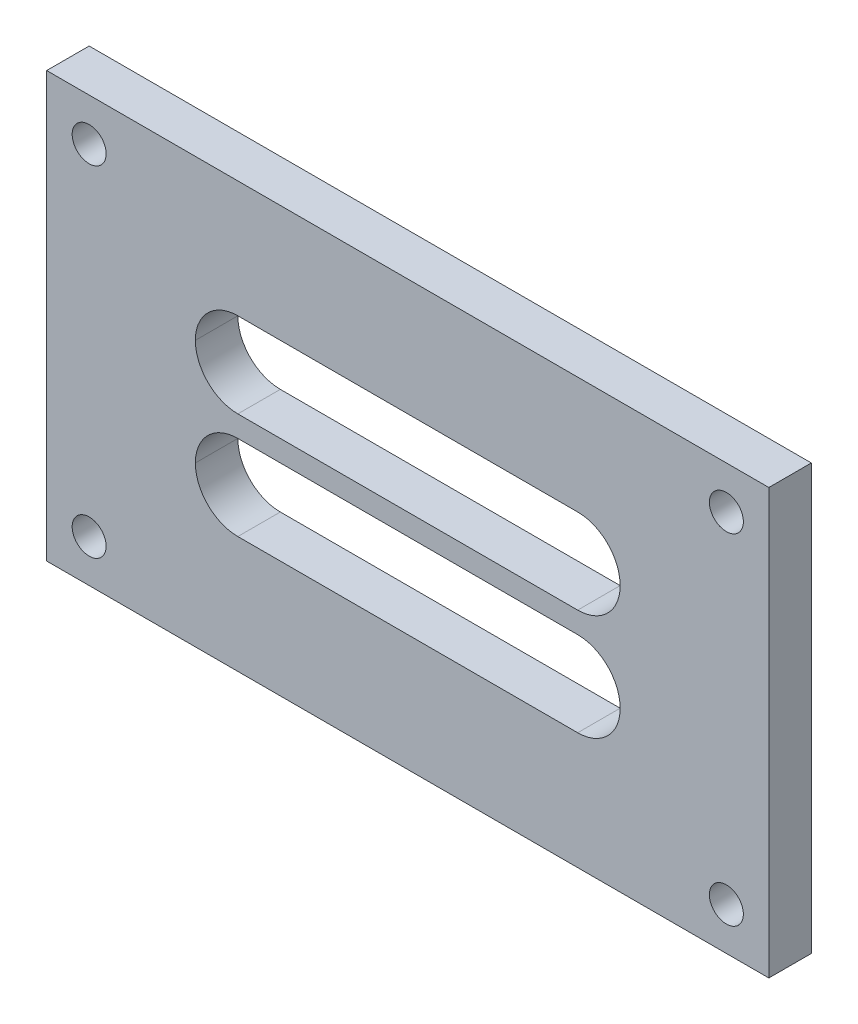
ISO-10303-21;
HEADER;
FILE_DESCRIPTION(('STEP AP214'),'2;1');
FILE_NAME('part.step','',(''),(''),'','','');
FILE_SCHEMA(('AUTOMOTIVE_DESIGN { 1 0 10303 214 1 1 1 1 }'));
ENDSEC;
DATA;
#1=APPLICATION_CONTEXT('core data for automotive mechanical design processes');
#2=APPLICATION_PROTOCOL_DEFINITION('international standard','automotive_design',2000,#1);
#3=PRODUCT_CONTEXT('',#1,'mechanical');
#4=PRODUCT('Part','Part','',(#3));
#5=PRODUCT_RELATED_PRODUCT_CATEGORY('part','',(#4));
#6=PRODUCT_DEFINITION_FORMATION('','',#4);
#7=PRODUCT_DEFINITION_CONTEXT('part definition',#1,'design');
#8=PRODUCT_DEFINITION('design','',#6,#7);
#9=PRODUCT_DEFINITION_SHAPE('','',#8);
#10=(LENGTH_UNIT() NAMED_UNIT(*) SI_UNIT(.MILLI.,.METRE.));
#11=(NAMED_UNIT(*) PLANE_ANGLE_UNIT() SI_UNIT($,.RADIAN.));
#12=(NAMED_UNIT(*) SI_UNIT($,.STERADIAN.) SOLID_ANGLE_UNIT());
#13=UNCERTAINTY_MEASURE_WITH_UNIT(LENGTH_MEASURE(1.E-05),#10,'distance_accuracy_value','');
#14=(GEOMETRIC_REPRESENTATION_CONTEXT(3) GLOBAL_UNCERTAINTY_ASSIGNED_CONTEXT((#13)) GLOBAL_UNIT_ASSIGNED_CONTEXT((#10,
#11,#12)) REPRESENTATION_CONTEXT('',''));
#15=CARTESIAN_POINT('',(0.,0.,0.));
#16=DIRECTION('',(0.,0.,1.));
#17=DIRECTION('',(1.,0.,0.));
#18=AXIS2_PLACEMENT_3D('',#15,#16,#17);
#19=CARTESIAN_POINT('',(0.,0.,2.));
#20=DIRECTION('',(0.,0.,1.));
#21=DIRECTION('',(1.,0.,0.));
#22=AXIS2_PLACEMENT_3D('',#19,#20,#21);
#23=PLANE('',#22);
#24=CARTESIAN_POINT('',(32.,18.,2.));
#25=DIRECTION('',(0.,0.,1.));
#26=DIRECTION('',(1.,0.,0.));
#27=AXIS2_PLACEMENT_3D('',#24,#25,#26);
#28=CIRCLE('',#27,0.800000000000003);
#29=CARTESIAN_POINT('',(32.8,18.,2.));
#30=VERTEX_POINT('',#29);
#31=EDGE_CURVE('E303',#30,#30,#28,.F.);
#32=ORIENTED_EDGE('',*,*,#31,.T.);
#33=EDGE_LOOP('',(#32));
#34=FACE_BOUND('',#33,.T.);
#35=CARTESIAN_POINT('',(1.99999999999999,2.,2.));
#36=DIRECTION('',(0.,0.,1.));
#37=DIRECTION('',(1.,0.,0.));
#38=AXIS2_PLACEMENT_3D('',#35,#36,#37);
#39=CIRCLE('',#38,0.799999999999999);
#40=CARTESIAN_POINT('',(2.79999999999999,2.,2.));
#41=VERTEX_POINT('',#40);
#42=EDGE_CURVE('E292',#41,#41,#39,.F.);
#43=ORIENTED_EDGE('',*,*,#42,.T.);
#44=EDGE_LOOP('',(#43));
#45=FACE_BOUND('',#44,.T.);
#46=DIRECTION('',(1.,0.,0.));
#47=VECTOR('',#46,1.);
#48=CARTESIAN_POINT('',(0.,5.5,2.));
#49=LINE('',#48,#47);
#50=CARTESIAN_POINT('',(9.,5.5,2.));
#51=VERTEX_POINT('',#50);
#52=CARTESIAN_POINT('',(25.,5.5,2.));
#53=VERTEX_POINT('',#52);
#54=EDGE_CURVE('E284',#51,#53,#49,.T.);
#55=ORIENTED_EDGE('',*,*,#54,.F.);
#56=CARTESIAN_POINT('',(9.,7.5,2.));
#57=DIRECTION('',(0.,0.,1.));
#58=DIRECTION('',(1.,0.,0.));
#59=AXIS2_PLACEMENT_3D('',#56,#57,#58);
#60=CIRCLE('',#59,2.);
#61=CARTESIAN_POINT('',(7.,7.5,2.));
#62=VERTEX_POINT('',#61);
#63=EDGE_CURVE('E237',#51,#62,#60,.F.);
#64=ORIENTED_EDGE('',*,*,#63,.T.);
#65=CARTESIAN_POINT('',(9.,7.5,2.));
#66=DIRECTION('',(0.,0.,1.));
#67=DIRECTION('',(1.,0.,0.));
#68=AXIS2_PLACEMENT_3D('',#65,#66,#67);
#69=CIRCLE('',#68,2.);
#70=CARTESIAN_POINT('',(9.,9.5,2.));
#71=VERTEX_POINT('',#70);
#72=EDGE_CURVE('E233',#62,#71,#69,.F.);
#73=ORIENTED_EDGE('',*,*,#72,.T.);
#74=DIRECTION('',(1.,0.,0.));
#75=VECTOR('',#74,1.);
#76=CARTESIAN_POINT('',(0.,9.5,2.));
#77=LINE('',#76,#75);
#78=CARTESIAN_POINT('',(25.,9.5,2.));
#79=VERTEX_POINT('',#78);
#80=EDGE_CURVE('E206',#71,#79,#77,.T.);
#81=ORIENTED_EDGE('',*,*,#80,.T.);
#82=CARTESIAN_POINT('',(25.,7.5,2.));
#83=DIRECTION('',(0.,0.,1.));
#84=DIRECTION('',(1.,0.,0.));
#85=AXIS2_PLACEMENT_3D('',#82,#83,#84);
#86=CIRCLE('',#85,2.);
#87=CARTESIAN_POINT('',(27.,7.50000000000001,2.));
#88=VERTEX_POINT('',#87);
#89=EDGE_CURVE('E241',#79,#88,#86,.F.);
#90=ORIENTED_EDGE('',*,*,#89,.T.);
#91=CARTESIAN_POINT('',(25.,7.5,2.));
#92=DIRECTION('',(0.,0.,1.));
#93=DIRECTION('',(1.,0.,0.));
#94=AXIS2_PLACEMENT_3D('',#91,#92,#93);
#95=CIRCLE('',#94,2.);
#96=EDGE_CURVE('E245',#88,#53,#95,.F.);
#97=ORIENTED_EDGE('',*,*,#96,.T.);
#98=EDGE_LOOP('',(#55,#64,#73,#81,#90,#97));
#99=FACE_BOUND('',#98,.T.);
#100=CARTESIAN_POINT('',(9.,12.5,2.));
#101=DIRECTION('',(0.,0.,1.));
#102=DIRECTION('',(1.,0.,0.));
#103=AXIS2_PLACEMENT_3D('',#100,#101,#102);
#104=CIRCLE('',#103,2.);
#105=CARTESIAN_POINT('',(9.,10.5,2.));
#106=VERTEX_POINT('',#105);
#107=CARTESIAN_POINT('',(7.,12.5,2.));
#108=VERTEX_POINT('',#107);
#109=EDGE_CURVE('E55',#106,#108,#104,.F.);
#110=ORIENTED_EDGE('',*,*,#109,.T.);
#111=CARTESIAN_POINT('',(9.,12.5,2.));
#112=DIRECTION('',(0.,0.,1.));
#113=DIRECTION('',(1.,0.,0.));
#114=AXIS2_PLACEMENT_3D('',#111,#112,#113);
#115=CIRCLE('',#114,2.);
#116=CARTESIAN_POINT('',(9.,14.5,2.));
#117=VERTEX_POINT('',#116);
#118=EDGE_CURVE('E11',#108,#117,#115,.F.);
#119=ORIENTED_EDGE('',*,*,#118,.T.);
#120=DIRECTION('',(1.,0.,0.));
#121=VECTOR('',#120,1.);
#122=CARTESIAN_POINT('',(0.,14.5,2.));
#123=LINE('',#122,#121);
#124=CARTESIAN_POINT('',(25.,14.5,2.));
#125=VERTEX_POINT('',#124);
#126=EDGE_CURVE('E279',#117,#125,#123,.T.);
#127=ORIENTED_EDGE('',*,*,#126,.T.);
#128=CARTESIAN_POINT('',(25.,12.5,2.));
#129=DIRECTION('',(0.,0.,1.));
#130=DIRECTION('',(1.,0.,0.));
#131=AXIS2_PLACEMENT_3D('',#128,#129,#130);
#132=CIRCLE('',#131,2.);
#133=CARTESIAN_POINT('',(27.,12.5,2.));
#134=VERTEX_POINT('',#133);
#135=EDGE_CURVE('E253',#125,#134,#132,.F.);
#136=ORIENTED_EDGE('',*,*,#135,.T.);
#137=CARTESIAN_POINT('',(25.,12.5,2.));
#138=DIRECTION('',(0.,0.,1.));
#139=DIRECTION('',(1.,0.,0.));
#140=AXIS2_PLACEMENT_3D('',#137,#138,#139);
#141=CIRCLE('',#140,2.);
#142=CARTESIAN_POINT('',(25.,10.5,2.));
#143=VERTEX_POINT('',#142);
#144=EDGE_CURVE('E249',#134,#143,#141,.F.);
#145=ORIENTED_EDGE('',*,*,#144,.T.);
#146=DIRECTION('',(1.,0.,0.));
#147=VECTOR('',#146,1.);
#148=CARTESIAN_POINT('',(0.,10.5,2.));
#149=LINE('',#148,#147);
#150=EDGE_CURVE('E173',#106,#143,#149,.T.);
#151=ORIENTED_EDGE('',*,*,#150,.F.);
#152=EDGE_LOOP('',(#110,#119,#127,#136,#145,#151));
#153=FACE_BOUND('',#152,.T.);
#154=DIRECTION('',(1.,0.,0.));
#155=VECTOR('',#154,1.);
#156=CARTESIAN_POINT('',(0.,20.,2.));
#157=LINE('',#156,#155);
#158=CARTESIAN_POINT('',(0.,20.,2.));
#159=VERTEX_POINT('',#158);
#160=CARTESIAN_POINT('',(34.,20.,2.));
#161=VERTEX_POINT('',#160);
#162=EDGE_CURVE('E156',#159,#161,#157,.T.);
#163=ORIENTED_EDGE('',*,*,#162,.F.);
#164=DIRECTION('',(0.,1.,0.));
#165=VECTOR('',#164,1.);
#166=CARTESIAN_POINT('',(0.,0.,2.));
#167=LINE('',#166,#165);
#168=CARTESIAN_POINT('',(0.,0.,2.));
#169=VERTEX_POINT('',#168);
#170=EDGE_CURVE('E170',#169,#159,#167,.T.);
#171=ORIENTED_EDGE('',*,*,#170,.F.);
#172=DIRECTION('',(1.,0.,0.));
#173=VECTOR('',#172,1.);
#174=CARTESIAN_POINT('',(0.,0.,2.));
#175=LINE('',#174,#173);
#176=CARTESIAN_POINT('',(34.,0.,2.));
#177=VERTEX_POINT('',#176);
#178=EDGE_CURVE('E177',#169,#177,#175,.T.);
#179=ORIENTED_EDGE('',*,*,#178,.T.);
#180=DIRECTION('',(0.,1.,0.));
#181=VECTOR('',#180,1.);
#182=CARTESIAN_POINT('',(34.,0.,2.));
#183=LINE('',#182,#181);
#184=EDGE_CURVE('E171',#177,#161,#183,.T.);
#185=ORIENTED_EDGE('',*,*,#184,.T.);
#186=EDGE_LOOP('',(#163,#171,#179,#185));
#187=FACE_BOUND('',#186,.T.);
#188=CARTESIAN_POINT('',(1.99999999999999,18.,2.));
#189=DIRECTION('',(0.,0.,1.));
#190=DIRECTION('',(1.,0.,0.));
#191=AXIS2_PLACEMENT_3D('',#188,#189,#190);
#192=CIRCLE('',#191,0.799999999999997);
#193=CARTESIAN_POINT('',(2.79999999999999,18.,2.));
#194=VERTEX_POINT('',#193);
#195=EDGE_CURVE('E309',#194,#194,#192,.T.);
#196=ORIENTED_EDGE('',*,*,#195,.F.);
#197=EDGE_LOOP('',(#196));
#198=FACE_BOUND('',#197,.T.);
#199=CARTESIAN_POINT('',(32.,1.99999999999999,2.));
#200=DIRECTION('',(0.,0.,1.));
#201=DIRECTION('',(1.,0.,0.));
#202=AXIS2_PLACEMENT_3D('',#199,#200,#201);
#203=CIRCLE('',#202,0.800000000000003);
#204=CARTESIAN_POINT('',(32.8,1.99999999999999,2.));
#205=VERTEX_POINT('',#204);
#206=EDGE_CURVE('E262',#205,#205,#203,.T.);
#207=ORIENTED_EDGE('',*,*,#206,.F.);
#208=EDGE_LOOP('',(#207));
#209=FACE_BOUND('',#208,.T.);
#210=ADVANCED_FACE('F39',(#34,#45,#99,#153,#187,#198,#209),#23,.T.);
#211=CARTESIAN_POINT('',(0.,0.,0.));
#212=DIRECTION('',(0.,0.,1.));
#213=DIRECTION('',(1.,0.,0.));
#214=AXIS2_PLACEMENT_3D('',#211,#212,#213);
#215=PLANE('',#214);
#216=CARTESIAN_POINT('',(1.99999999999999,18.,0.));
#217=DIRECTION('',(0.,0.,1.));
#218=DIRECTION('',(1.,0.,0.));
#219=AXIS2_PLACEMENT_3D('',#216,#217,#218);
#220=CIRCLE('',#219,0.799999999999997);
#221=CARTESIAN_POINT('',(2.79999999999999,18.,0.));
#222=VERTEX_POINT('',#221);
#223=EDGE_CURVE('E295',#222,#222,#220,.T.);
#224=ORIENTED_EDGE('',*,*,#223,.T.);
#225=EDGE_LOOP('',(#224));
#226=FACE_BOUND('',#225,.T.);
#227=CARTESIAN_POINT('',(1.99999999999999,2.,0.));
#228=DIRECTION('',(0.,0.,1.));
#229=DIRECTION('',(1.,0.,0.));
#230=AXIS2_PLACEMENT_3D('',#227,#228,#229);
#231=CIRCLE('',#230,0.799999999999999);
#232=CARTESIAN_POINT('',(2.79999999999999,2.,0.));
#233=VERTEX_POINT('',#232);
#234=EDGE_CURVE('E188',#233,#233,#231,.F.);
#235=ORIENTED_EDGE('',*,*,#234,.F.);
#236=EDGE_LOOP('',(#235));
#237=FACE_BOUND('',#236,.T.);
#238=CARTESIAN_POINT('',(9.,7.5,0.));
#239=DIRECTION('',(0.,0.,1.));
#240=DIRECTION('',(1.,0.,0.));
#241=AXIS2_PLACEMENT_3D('',#238,#239,#240);
#242=CIRCLE('',#241,2.);
#243=CARTESIAN_POINT('',(9.,9.5,0.));
#244=VERTEX_POINT('',#243);
#245=CARTESIAN_POINT('',(7.,7.5,0.));
#246=VERTEX_POINT('',#245);
#247=EDGE_CURVE('E231',#244,#246,#242,.T.);
#248=ORIENTED_EDGE('',*,*,#247,.T.);
#249=CARTESIAN_POINT('',(9.,7.5,0.));
#250=DIRECTION('',(0.,0.,1.));
#251=DIRECTION('',(1.,0.,0.));
#252=AXIS2_PLACEMENT_3D('',#249,#250,#251);
#253=CIRCLE('',#252,2.);
#254=CARTESIAN_POINT('',(9.,5.5,0.));
#255=VERTEX_POINT('',#254);
#256=EDGE_CURVE('E235',#246,#255,#253,.T.);
#257=ORIENTED_EDGE('',*,*,#256,.T.);
#258=DIRECTION('',(1.,0.,0.));
#259=VECTOR('',#258,1.);
#260=CARTESIAN_POINT('',(0.,5.5,0.));
#261=LINE('',#260,#259);
#262=CARTESIAN_POINT('',(25.,5.5,0.));
#263=VERTEX_POINT('',#262);
#264=EDGE_CURVE('E187',#255,#263,#261,.T.);
#265=ORIENTED_EDGE('',*,*,#264,.T.);
#266=CARTESIAN_POINT('',(25.,7.5,0.));
#267=DIRECTION('',(0.,0.,1.));
#268=DIRECTION('',(1.,0.,0.));
#269=AXIS2_PLACEMENT_3D('',#266,#267,#268);
#270=CIRCLE('',#269,2.);
#271=CARTESIAN_POINT('',(27.,7.50000000000001,0.));
#272=VERTEX_POINT('',#271);
#273=EDGE_CURVE('E243',#263,#272,#270,.T.);
#274=ORIENTED_EDGE('',*,*,#273,.T.);
#275=CARTESIAN_POINT('',(25.,7.5,0.));
#276=DIRECTION('',(0.,0.,1.));
#277=DIRECTION('',(1.,0.,0.));
#278=AXIS2_PLACEMENT_3D('',#275,#276,#277);
#279=CIRCLE('',#278,2.);
#280=CARTESIAN_POINT('',(25.,9.5,0.));
#281=VERTEX_POINT('',#280);
#282=EDGE_CURVE('E239',#272,#281,#279,.T.);
#283=ORIENTED_EDGE('',*,*,#282,.T.);
#284=DIRECTION('',(1.,0.,0.));
#285=VECTOR('',#284,1.);
#286=CARTESIAN_POINT('',(0.,9.5,0.));
#287=LINE('',#286,#285);
#288=EDGE_CURVE('E184',#244,#281,#287,.T.);
#289=ORIENTED_EDGE('',*,*,#288,.F.);
#290=EDGE_LOOP('',(#248,#257,#265,#274,#283,#289));
#291=FACE_BOUND('',#290,.T.);
#292=DIRECTION('',(1.,0.,0.));
#293=VECTOR('',#292,1.);
#294=CARTESIAN_POINT('',(0.,14.5,0.));
#295=LINE('',#294,#293);
#296=CARTESIAN_POINT('',(9.,14.5,0.));
#297=VERTEX_POINT('',#296);
#298=CARTESIAN_POINT('',(25.,14.5,0.));
#299=VERTEX_POINT('',#298);
#300=EDGE_CURVE('E191',#297,#299,#295,.T.);
#301=ORIENTED_EDGE('',*,*,#300,.F.);
#302=CARTESIAN_POINT('',(9.,12.5,0.));
#303=DIRECTION('',(0.,0.,1.));
#304=DIRECTION('',(1.,0.,0.));
#305=AXIS2_PLACEMENT_3D('',#302,#303,#304);
#306=CIRCLE('',#305,2.);
#307=CARTESIAN_POINT('',(7.,12.5,0.));
#308=VERTEX_POINT('',#307);
#309=EDGE_CURVE('E48',#297,#308,#306,.T.);
#310=ORIENTED_EDGE('',*,*,#309,.T.);
#311=CARTESIAN_POINT('',(9.,12.5,0.));
#312=DIRECTION('',(0.,0.,1.));
#313=DIRECTION('',(1.,0.,0.));
#314=AXIS2_PLACEMENT_3D('',#311,#312,#313);
#315=CIRCLE('',#314,2.);
#316=CARTESIAN_POINT('',(9.,10.5,0.));
#317=VERTEX_POINT('',#316);
#318=EDGE_CURVE('E255',#308,#317,#315,.T.);
#319=ORIENTED_EDGE('',*,*,#318,.T.);
#320=DIRECTION('',(1.,0.,0.));
#321=VECTOR('',#320,1.);
#322=CARTESIAN_POINT('',(0.,10.5,0.));
#323=LINE('',#322,#321);
#324=CARTESIAN_POINT('',(25.,10.5,0.));
#325=VERTEX_POINT('',#324);
#326=EDGE_CURVE('E194',#317,#325,#323,.T.);
#327=ORIENTED_EDGE('',*,*,#326,.T.);
#328=CARTESIAN_POINT('',(25.,12.5,0.));
#329=DIRECTION('',(0.,0.,1.));
#330=DIRECTION('',(1.,0.,0.));
#331=AXIS2_PLACEMENT_3D('',#328,#329,#330);
#332=CIRCLE('',#331,2.);
#333=CARTESIAN_POINT('',(27.,12.5,0.));
#334=VERTEX_POINT('',#333);
#335=EDGE_CURVE('E247',#325,#334,#332,.T.);
#336=ORIENTED_EDGE('',*,*,#335,.T.);
#337=CARTESIAN_POINT('',(25.,12.5,0.));
#338=DIRECTION('',(0.,0.,1.));
#339=DIRECTION('',(1.,0.,0.));
#340=AXIS2_PLACEMENT_3D('',#337,#338,#339);
#341=CIRCLE('',#340,2.);
#342=EDGE_CURVE('E251',#334,#299,#341,.T.);
#343=ORIENTED_EDGE('',*,*,#342,.T.);
#344=EDGE_LOOP('',(#301,#310,#319,#327,#336,#343));
#345=FACE_BOUND('',#344,.T.);
#346=DIRECTION('',(1.,0.,0.));
#347=VECTOR('',#346,1.);
#348=CARTESIAN_POINT('',(0.,20.,0.));
#349=LINE('',#348,#347);
#350=CARTESIAN_POINT('',(0.,20.,0.));
#351=VERTEX_POINT('',#350);
#352=CARTESIAN_POINT('',(34.,20.,0.));
#353=VERTEX_POINT('',#352);
#354=EDGE_CURVE('E158',#351,#353,#349,.T.);
#355=ORIENTED_EDGE('',*,*,#354,.T.);
#356=DIRECTION('',(0.,1.,0.));
#357=VECTOR('',#356,1.);
#358=CARTESIAN_POINT('',(34.,0.,0.));
#359=LINE('',#358,#357);
#360=CARTESIAN_POINT('',(34.,0.,0.));
#361=VERTEX_POINT('',#360);
#362=EDGE_CURVE('E203',#361,#353,#359,.T.);
#363=ORIENTED_EDGE('',*,*,#362,.F.);
#364=DIRECTION('',(1.,0.,0.));
#365=VECTOR('',#364,1.);
#366=CARTESIAN_POINT('',(0.,0.,0.));
#367=LINE('',#366,#365);
#368=CARTESIAN_POINT('',(0.,0.,0.));
#369=VERTEX_POINT('',#368);
#370=EDGE_CURVE('E200',#369,#361,#367,.T.);
#371=ORIENTED_EDGE('',*,*,#370,.F.);
#372=DIRECTION('',(0.,1.,0.));
#373=VECTOR('',#372,1.);
#374=CARTESIAN_POINT('',(0.,0.,0.));
#375=LINE('',#374,#373);
#376=EDGE_CURVE('E198',#369,#351,#375,.T.);
#377=ORIENTED_EDGE('',*,*,#376,.T.);
#378=EDGE_LOOP('',(#355,#363,#371,#377));
#379=FACE_BOUND('',#378,.T.);
#380=CARTESIAN_POINT('',(32.,18.,0.));
#381=DIRECTION('',(0.,0.,1.));
#382=DIRECTION('',(1.,0.,0.));
#383=AXIS2_PLACEMENT_3D('',#380,#381,#382);
#384=CIRCLE('',#383,0.800000000000003);
#385=CARTESIAN_POINT('',(32.8,18.,0.));
#386=VERTEX_POINT('',#385);
#387=EDGE_CURVE('E306',#386,#386,#384,.F.);
#388=ORIENTED_EDGE('',*,*,#387,.F.);
#389=EDGE_LOOP('',(#388));
#390=FACE_BOUND('',#389,.T.);
#391=CARTESIAN_POINT('',(32.,1.99999999999999,0.));
#392=DIRECTION('',(0.,0.,1.));
#393=DIRECTION('',(1.,0.,0.));
#394=AXIS2_PLACEMENT_3D('',#391,#392,#393);
#395=CIRCLE('',#394,0.800000000000003);
#396=CARTESIAN_POINT('',(32.8,1.99999999999999,0.));
#397=VERTEX_POINT('',#396);
#398=EDGE_CURVE('E300',#397,#397,#395,.T.);
#399=ORIENTED_EDGE('',*,*,#398,.T.);
#400=EDGE_LOOP('',(#399));
#401=FACE_BOUND('',#400,.T.);
#402=ADVANCED_FACE('F315',(#226,#237,#291,#345,#379,#390,#401),#215,.F.);
#403=CARTESIAN_POINT('',(0.,20.,2.));
#404=DIRECTION('',(0.,1.,0.));
#405=DIRECTION('',(0.,0.,1.));
#406=AXIS2_PLACEMENT_3D('',#403,#404,#405);
#407=PLANE('',#406);
#408=ORIENTED_EDGE('',*,*,#354,.F.);
#409=DIRECTION('',(0.,0.,-1.));
#410=VECTOR('',#409,1.);
#411=CARTESIAN_POINT('',(0.,20.,2.));
#412=LINE('',#411,#410);
#413=EDGE_CURVE('E153',#159,#351,#412,.T.);
#414=ORIENTED_EDGE('',*,*,#413,.F.);
#415=ORIENTED_EDGE('',*,*,#162,.T.);
#416=DIRECTION('',(0.,0.,-1.));
#417=VECTOR('',#416,1.);
#418=CARTESIAN_POINT('',(34.,20.,2.));
#419=LINE('',#418,#417);
#420=EDGE_CURVE('E183',#161,#353,#419,.T.);
#421=ORIENTED_EDGE('',*,*,#420,.T.);
#422=EDGE_LOOP('',(#408,#414,#415,#421));
#423=FACE_BOUND('',#422,.T.);
#424=ADVANCED_FACE('F155',(#423),#407,.T.);
#425=CARTESIAN_POINT('',(0.,0.,2.));
#426=DIRECTION('',(-1.,0.,0.));
#427=DIRECTION('',(0.,-1.,0.));
#428=AXIS2_PLACEMENT_3D('',#425,#426,#427);
#429=PLANE('',#428);
#430=ORIENTED_EDGE('',*,*,#376,.F.);
#431=DIRECTION('',(0.,0.,-1.));
#432=VECTOR('',#431,1.);
#433=CARTESIAN_POINT('',(0.,0.,2.));
#434=LINE('',#433,#432);
#435=EDGE_CURVE('E164',#169,#369,#434,.T.);
#436=ORIENTED_EDGE('',*,*,#435,.F.);
#437=ORIENTED_EDGE('',*,*,#170,.T.);
#438=ORIENTED_EDGE('',*,*,#413,.T.);
#439=EDGE_LOOP('',(#430,#436,#437,#438));
#440=FACE_BOUND('',#439,.T.);
#441=ADVANCED_FACE('F175',(#440),#429,.T.);
#442=CARTESIAN_POINT('',(0.,0.,2.));
#443=DIRECTION('',(0.,1.,0.));
#444=DIRECTION('',(-1.,0.,0.));
#445=AXIS2_PLACEMENT_3D('',#442,#443,#444);
#446=PLANE('',#445);
#447=ORIENTED_EDGE('',*,*,#370,.T.);
#448=DIRECTION('',(0.,0.,-1.));
#449=VECTOR('',#448,1.);
#450=CARTESIAN_POINT('',(34.,0.,2.));
#451=LINE('',#450,#449);
#452=EDGE_CURVE('E208',#177,#361,#451,.T.);
#453=ORIENTED_EDGE('',*,*,#452,.F.);
#454=ORIENTED_EDGE('',*,*,#178,.F.);
#455=ORIENTED_EDGE('',*,*,#435,.T.);
#456=EDGE_LOOP('',(#447,#453,#454,#455));
#457=FACE_BOUND('',#456,.T.);
#458=ADVANCED_FACE('F357',(#457),#446,.F.);
#459=CARTESIAN_POINT('',(0.,14.5,2.));
#460=DIRECTION('',(0.,1.,0.));
#461=DIRECTION('',(0.,0.,1.));
#462=AXIS2_PLACEMENT_3D('',#459,#460,#461);
#463=PLANE('',#462);
#464=ORIENTED_EDGE('',*,*,#300,.T.);
#465=DIRECTION('',(0.,0.,-1.));
#466=VECTOR('',#465,1.);
#467=CARTESIAN_POINT('',(25.,14.5,2.));
#468=LINE('',#467,#466);
#469=EDGE_CURVE('E229',#299,#125,#468,.F.);
#470=ORIENTED_EDGE('',*,*,#469,.T.);
#471=ORIENTED_EDGE('',*,*,#126,.F.);
#472=DIRECTION('',(0.,0.,-1.));
#473=VECTOR('',#472,1.);
#474=CARTESIAN_POINT('',(9.,14.5,2.));
#475=LINE('',#474,#473);
#476=EDGE_CURVE('E227',#117,#297,#475,.T.);
#477=ORIENTED_EDGE('',*,*,#476,.T.);
#478=EDGE_LOOP('',(#464,#470,#471,#477));
#479=FACE_BOUND('',#478,.T.);
#480=ADVANCED_FACE('F282',(#479),#463,.F.);
#481=CARTESIAN_POINT('',(0.,9.5,2.));
#482=DIRECTION('',(0.,1.,0.));
#483=DIRECTION('',(0.,0.,1.));
#484=AXIS2_PLACEMENT_3D('',#481,#482,#483);
#485=PLANE('',#484);
#486=ORIENTED_EDGE('',*,*,#80,.F.);
#487=DIRECTION('',(0.,0.,-1.));
#488=VECTOR('',#487,1.);
#489=CARTESIAN_POINT('',(9.,9.5,0.));
#490=LINE('',#489,#488);
#491=EDGE_CURVE('E214',#71,#244,#490,.T.);
#492=ORIENTED_EDGE('',*,*,#491,.T.);
#493=ORIENTED_EDGE('',*,*,#288,.T.);
#494=DIRECTION('',(0.,0.,-1.));
#495=VECTOR('',#494,1.);
#496=CARTESIAN_POINT('',(25.,9.5,2.));
#497=LINE('',#496,#495);
#498=EDGE_CURVE('E163',#281,#79,#497,.F.);
#499=ORIENTED_EDGE('',*,*,#498,.T.);
#500=EDGE_LOOP('',(#486,#492,#493,#499));
#501=FACE_BOUND('',#500,.T.);
#502=ADVANCED_FACE('F368',(#501),#485,.F.);
#503=CARTESIAN_POINT('',(0.,10.5,2.));
#504=DIRECTION('',(0.,1.,0.));
#505=DIRECTION('',(0.,0.,1.));
#506=AXIS2_PLACEMENT_3D('',#503,#504,#505);
#507=PLANE('',#506);
#508=ORIENTED_EDGE('',*,*,#150,.T.);
#509=DIRECTION('',(0.,0.,-1.));
#510=VECTOR('',#509,1.);
#511=CARTESIAN_POINT('',(25.,10.5,2.));
#512=LINE('',#511,#510);
#513=EDGE_CURVE('E224',#143,#325,#512,.T.);
#514=ORIENTED_EDGE('',*,*,#513,.T.);
#515=ORIENTED_EDGE('',*,*,#326,.F.);
#516=DIRECTION('',(0.,0.,-1.));
#517=VECTOR('',#516,1.);
#518=CARTESIAN_POINT('',(9.,10.5,2.));
#519=LINE('',#518,#517);
#520=EDGE_CURVE('E221',#317,#106,#519,.F.);
#521=ORIENTED_EDGE('',*,*,#520,.T.);
#522=EDGE_LOOP('',(#508,#514,#515,#521));
#523=FACE_BOUND('',#522,.T.);
#524=ADVANCED_FACE('F365',(#523),#507,.T.);
#525=CARTESIAN_POINT('',(0.,5.5,2.));
#526=DIRECTION('',(0.,1.,0.));
#527=DIRECTION('',(0.,0.,1.));
#528=AXIS2_PLACEMENT_3D('',#525,#526,#527);
#529=PLANE('',#528);
#530=ORIENTED_EDGE('',*,*,#264,.F.);
#531=DIRECTION('',(0.,0.,-1.));
#532=VECTOR('',#531,1.);
#533=CARTESIAN_POINT('',(9.,5.5,2.));
#534=LINE('',#533,#532);
#535=EDGE_CURVE('E219',#255,#51,#534,.F.);
#536=ORIENTED_EDGE('',*,*,#535,.T.);
#537=ORIENTED_EDGE('',*,*,#54,.T.);
#538=DIRECTION('',(0.,0.,-1.));
#539=VECTOR('',#538,1.);
#540=CARTESIAN_POINT('',(25.,5.5,0.));
#541=LINE('',#540,#539);
#542=EDGE_CURVE('E217',#53,#263,#541,.T.);
#543=ORIENTED_EDGE('',*,*,#542,.T.);
#544=EDGE_LOOP('',(#530,#536,#537,#543));
#545=FACE_BOUND('',#544,.T.);
#546=ADVANCED_FACE('F355',(#545),#529,.T.);
#547=CARTESIAN_POINT('',(34.,0.,2.));
#548=DIRECTION('',(-1.,0.,0.));
#549=DIRECTION('',(0.,-1.,0.));
#550=AXIS2_PLACEMENT_3D('',#547,#548,#549);
#551=PLANE('',#550);
#552=ORIENTED_EDGE('',*,*,#362,.T.);
#553=ORIENTED_EDGE('',*,*,#420,.F.);
#554=ORIENTED_EDGE('',*,*,#184,.F.);
#555=ORIENTED_EDGE('',*,*,#452,.T.);
#556=EDGE_LOOP('',(#552,#553,#554,#555));
#557=FACE_BOUND('',#556,.T.);
#558=ADVANCED_FACE('F348',(#557),#551,.F.);
#559=CARTESIAN_POINT('',(1.99999999999999,2.,0.));
#560=DIRECTION('',(0.,0.,1.));
#561=DIRECTION('',(1.,0.,0.));
#562=AXIS2_PLACEMENT_3D('',#559,#560,#561);
#563=CYLINDRICAL_SURFACE('',#562,0.799999999999999);
#564=ORIENTED_EDGE('',*,*,#234,.T.);
#565=EDGE_LOOP('',(#564));
#566=FACE_BOUND('',#565,.T.);
#567=ORIENTED_EDGE('',*,*,#42,.F.);
#568=EDGE_LOOP('',(#567));
#569=FACE_BOUND('',#568,.T.);
#570=ADVANCED_FACE('F322',(#566,#569),#563,.F.);
#571=CARTESIAN_POINT('',(1.99999999999999,18.,0.));
#572=DIRECTION('',(0.,0.,1.));
#573=DIRECTION('',(1.,0.,0.));
#574=AXIS2_PLACEMENT_3D('',#571,#572,#573);
#575=CYLINDRICAL_SURFACE('',#574,0.799999999999997);
#576=ORIENTED_EDGE('',*,*,#223,.F.);
#577=EDGE_LOOP('',(#576));
#578=FACE_BOUND('',#577,.T.);
#579=ORIENTED_EDGE('',*,*,#195,.T.);
#580=EDGE_LOOP('',(#579));
#581=FACE_BOUND('',#580,.T.);
#582=ADVANCED_FACE('F318',(#578,#581),#575,.F.);
#583=CARTESIAN_POINT('',(32.,18.,0.));
#584=DIRECTION('',(0.,0.,1.));
#585=DIRECTION('',(1.,0.,0.));
#586=AXIS2_PLACEMENT_3D('',#583,#584,#585);
#587=CYLINDRICAL_SURFACE('',#586,0.800000000000003);
#588=ORIENTED_EDGE('',*,*,#387,.T.);
#589=EDGE_LOOP('',(#588));
#590=FACE_BOUND('',#589,.T.);
#591=ORIENTED_EDGE('',*,*,#31,.F.);
#592=EDGE_LOOP('',(#591));
#593=FACE_BOUND('',#592,.T.);
#594=ADVANCED_FACE('F321',(#590,#593),#587,.F.);
#595=CARTESIAN_POINT('',(32.,1.99999999999999,0.));
#596=DIRECTION('',(0.,0.,1.));
#597=DIRECTION('',(1.,0.,0.));
#598=AXIS2_PLACEMENT_3D('',#595,#596,#597);
#599=CYLINDRICAL_SURFACE('',#598,0.800000000000003);
#600=ORIENTED_EDGE('',*,*,#398,.F.);
#601=EDGE_LOOP('',(#600));
#602=FACE_BOUND('',#601,.T.);
#603=ORIENTED_EDGE('',*,*,#206,.T.);
#604=EDGE_LOOP('',(#603));
#605=FACE_BOUND('',#604,.T.);
#606=ADVANCED_FACE('F331',(#602,#605),#599,.F.);
#607=CARTESIAN_POINT('',(9.,7.5,2.));
#608=DIRECTION('',(0.,0.,-1.));
#609=DIRECTION('',(-1.,0.,0.));
#610=AXIS2_PLACEMENT_3D('',#607,#608,#609);
#611=CYLINDRICAL_SURFACE('',#610,2.);
#612=DIRECTION('',(0.,0.,-1.));
#613=VECTOR('',#612,1.);
#614=CARTESIAN_POINT('',(7.,7.5,2.));
#615=LINE('',#614,#613);
#616=EDGE_CURVE('E259',#62,#246,#615,.T.);
#617=ORIENTED_EDGE('',*,*,#616,.F.);
#618=ORIENTED_EDGE('',*,*,#63,.F.);
#619=ORIENTED_EDGE('',*,*,#535,.F.);
#620=ORIENTED_EDGE('',*,*,#256,.F.);
#621=EDGE_LOOP('',(#617,#618,#619,#620));
#622=FACE_BOUND('',#621,.T.);
#623=ADVANCED_FACE('F333',(#622),#611,.F.);
#624=CARTESIAN_POINT('',(9.,7.5,2.));
#625=DIRECTION('',(0.,0.,1.));
#626=DIRECTION('',(1.,0.,0.));
#627=AXIS2_PLACEMENT_3D('',#624,#625,#626);
#628=CYLINDRICAL_SURFACE('',#627,2.);
#629=ORIENTED_EDGE('',*,*,#72,.F.);
#630=ORIENTED_EDGE('',*,*,#616,.T.);
#631=ORIENTED_EDGE('',*,*,#247,.F.);
#632=ORIENTED_EDGE('',*,*,#491,.F.);
#633=EDGE_LOOP('',(#629,#630,#631,#632));
#634=FACE_BOUND('',#633,.T.);
#635=ADVANCED_FACE('F340',(#634),#628,.F.);
#636=CARTESIAN_POINT('',(25.,7.5,2.));
#637=DIRECTION('',(0.,0.,1.));
#638=DIRECTION('',(1.,0.,0.));
#639=AXIS2_PLACEMENT_3D('',#636,#637,#638);
#640=CYLINDRICAL_SURFACE('',#639,2.);
#641=ORIENTED_EDGE('',*,*,#542,.F.);
#642=ORIENTED_EDGE('',*,*,#96,.F.);
#643=DIRECTION('',(0.,0.,-1.));
#644=VECTOR('',#643,1.);
#645=CARTESIAN_POINT('',(27.,7.50000000000001,2.));
#646=LINE('',#645,#644);
#647=EDGE_CURVE('E263',#272,#88,#646,.F.);
#648=ORIENTED_EDGE('',*,*,#647,.F.);
#649=ORIENTED_EDGE('',*,*,#273,.F.);
#650=EDGE_LOOP('',(#641,#642,#648,#649));
#651=FACE_BOUND('',#650,.T.);
#652=ADVANCED_FACE('F379',(#651),#640,.F.);
#653=CARTESIAN_POINT('',(25.,7.5,2.));
#654=DIRECTION('',(0.,0.,-1.));
#655=DIRECTION('',(-1.,0.,0.));
#656=AXIS2_PLACEMENT_3D('',#653,#654,#655);
#657=CYLINDRICAL_SURFACE('',#656,2.);
#658=ORIENTED_EDGE('',*,*,#89,.F.);
#659=ORIENTED_EDGE('',*,*,#498,.F.);
#660=ORIENTED_EDGE('',*,*,#282,.F.);
#661=ORIENTED_EDGE('',*,*,#647,.T.);
#662=EDGE_LOOP('',(#658,#659,#660,#661));
#663=FACE_BOUND('',#662,.T.);
#664=ADVANCED_FACE('F382',(#663),#657,.F.);
#665=CARTESIAN_POINT('',(25.,12.5,2.));
#666=DIRECTION('',(0.,0.,1.));
#667=DIRECTION('',(1.,0.,0.));
#668=AXIS2_PLACEMENT_3D('',#665,#666,#667);
#669=CYLINDRICAL_SURFACE('',#668,2.);
#670=DIRECTION('',(0.,0.,-1.));
#671=VECTOR('',#670,1.);
#672=CARTESIAN_POINT('',(27.,12.5,0.));
#673=LINE('',#672,#671);
#674=EDGE_CURVE('E265',#134,#334,#673,.T.);
#675=ORIENTED_EDGE('',*,*,#674,.F.);
#676=ORIENTED_EDGE('',*,*,#135,.F.);
#677=ORIENTED_EDGE('',*,*,#469,.F.);
#678=ORIENTED_EDGE('',*,*,#342,.F.);
#679=EDGE_LOOP('',(#675,#676,#677,#678));
#680=FACE_BOUND('',#679,.T.);
#681=ADVANCED_FACE('F385',(#680),#669,.F.);
#682=CARTESIAN_POINT('',(25.,12.5,2.));
#683=DIRECTION('',(0.,0.,-1.));
#684=DIRECTION('',(-1.,0.,0.));
#685=AXIS2_PLACEMENT_3D('',#682,#683,#684);
#686=CYLINDRICAL_SURFACE('',#685,2.);
#687=ORIENTED_EDGE('',*,*,#144,.F.);
#688=ORIENTED_EDGE('',*,*,#674,.T.);
#689=ORIENTED_EDGE('',*,*,#335,.F.);
#690=ORIENTED_EDGE('',*,*,#513,.F.);
#691=EDGE_LOOP('',(#687,#688,#689,#690));
#692=FACE_BOUND('',#691,.T.);
#693=ADVANCED_FACE('F390',(#692),#686,.F.);
#694=CARTESIAN_POINT('',(9.,12.5,2.));
#695=DIRECTION('',(0.,0.,-1.));
#696=DIRECTION('',(-1.,0.,0.));
#697=AXIS2_PLACEMENT_3D('',#694,#695,#696);
#698=CYLINDRICAL_SURFACE('',#697,2.);
#699=ORIENTED_EDGE('',*,*,#476,.F.);
#700=ORIENTED_EDGE('',*,*,#118,.F.);
#701=DIRECTION('',(0.,0.,-1.));
#702=VECTOR('',#701,1.);
#703=CARTESIAN_POINT('',(7.,12.5,2.));
#704=LINE('',#703,#702);
#705=EDGE_CURVE('E43',#308,#108,#704,.F.);
#706=ORIENTED_EDGE('',*,*,#705,.F.);
#707=ORIENTED_EDGE('',*,*,#309,.F.);
#708=EDGE_LOOP('',(#699,#700,#706,#707));
#709=FACE_BOUND('',#708,.T.);
#710=ADVANCED_FACE('F41',(#709),#698,.F.);
#711=CARTESIAN_POINT('',(9.,12.5,2.));
#712=DIRECTION('',(0.,0.,1.));
#713=DIRECTION('',(1.,0.,0.));
#714=AXIS2_PLACEMENT_3D('',#711,#712,#713);
#715=CYLINDRICAL_SURFACE('',#714,2.);
#716=ORIENTED_EDGE('',*,*,#109,.F.);
#717=ORIENTED_EDGE('',*,*,#520,.F.);
#718=ORIENTED_EDGE('',*,*,#318,.F.);
#719=ORIENTED_EDGE('',*,*,#705,.T.);
#720=EDGE_LOOP('',(#716,#717,#718,#719));
#721=FACE_BOUND('',#720,.T.);
#722=ADVANCED_FACE('F273',(#721),#715,.F.);
#723=CLOSED_SHELL('',(#210,#402,#424,#441,#458,#480,#502,#524,#546,#558,#570,#582,#594,#606,
#623,#635,#652,#664,#681,#693,#710,#722));
#724=MANIFOLD_SOLID_BREP('B2',#723);
#725=ADVANCED_BREP_SHAPE_REPRESENTATION('',(#18,#724),#14);
#726=SHAPE_DEFINITION_REPRESENTATION(#9,#725);
ENDSEC;
END-ISO-10303-21;
